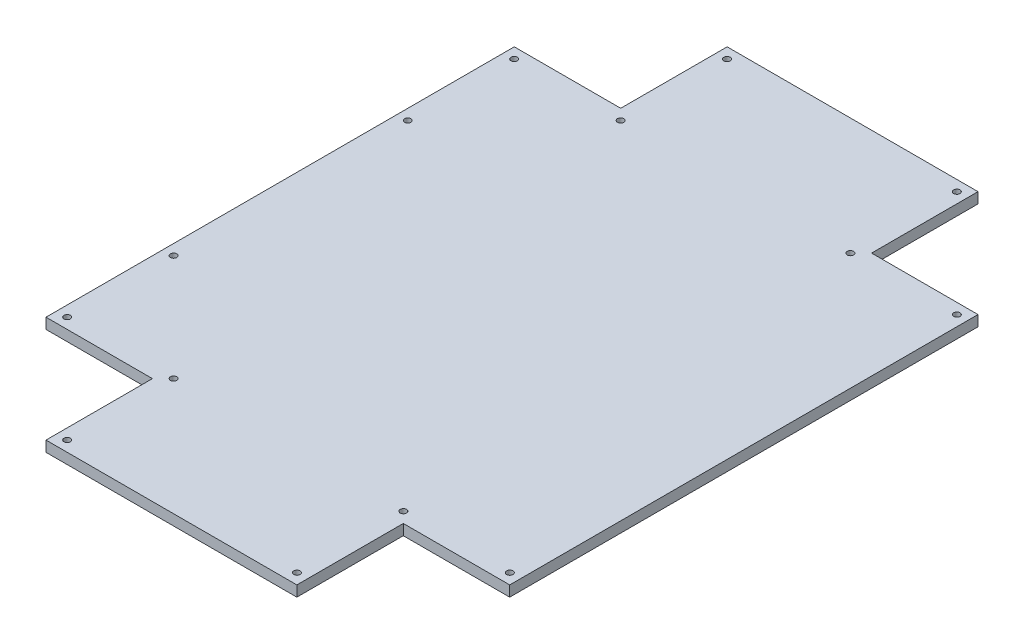
ISO-10303-21;
HEADER;
FILE_DESCRIPTION(('STEP AP214'),'2;1');
FILE_NAME('part.step','',(''),(''),'','','');
FILE_SCHEMA(('AUTOMOTIVE_DESIGN { 1 0 10303 214 1 1 1 1 }'));
ENDSEC;
DATA;
#1=APPLICATION_CONTEXT('core data for automotive mechanical design processes');
#2=APPLICATION_PROTOCOL_DEFINITION('international standard','automotive_design',2000,#1);
#3=PRODUCT_CONTEXT('',#1,'mechanical');
#4=PRODUCT('Part','Part','',(#3));
#5=PRODUCT_RELATED_PRODUCT_CATEGORY('part','',(#4));
#6=PRODUCT_DEFINITION_FORMATION('','',#4);
#7=PRODUCT_DEFINITION_CONTEXT('part definition',#1,'design');
#8=PRODUCT_DEFINITION('design','',#6,#7);
#9=PRODUCT_DEFINITION_SHAPE('','',#8);
#10=(LENGTH_UNIT() NAMED_UNIT(*) SI_UNIT(.MILLI.,.METRE.));
#11=(NAMED_UNIT(*) PLANE_ANGLE_UNIT() SI_UNIT($,.RADIAN.));
#12=(NAMED_UNIT(*) SI_UNIT($,.STERADIAN.) SOLID_ANGLE_UNIT());
#13=UNCERTAINTY_MEASURE_WITH_UNIT(LENGTH_MEASURE(1.E-05),#10,'distance_accuracy_value','');
#14=(GEOMETRIC_REPRESENTATION_CONTEXT(3) GLOBAL_UNCERTAINTY_ASSIGNED_CONTEXT((#13)) GLOBAL_UNIT_ASSIGNED_CONTEXT((#10,
#11,#12)) REPRESENTATION_CONTEXT('',''));
#15=CARTESIAN_POINT('',(0.,0.,0.));
#16=DIRECTION('',(0.,0.,1.));
#17=DIRECTION('',(1.,0.,0.));
#18=AXIS2_PLACEMENT_3D('',#15,#16,#17);
#19=CARTESIAN_POINT('',(0.,5.,0.));
#20=DIRECTION('',(0.,1.,0.));
#21=DIRECTION('',(0.,0.,1.));
#22=AXIS2_PLACEMENT_3D('',#19,#20,#21);
#23=PLANE('',#22);
#24=CARTESIAN_POINT('',(53.9763023364413,5.,-105.));
#25=DIRECTION('',(0.,1.,0.));
#26=DIRECTION('',(0.,0.,1.));
#27=AXIS2_PLACEMENT_3D('',#24,#25,#26);
#28=CIRCLE('',#27,1.5);
#29=CARTESIAN_POINT('',(53.9763023364413,5.,-103.5));
#30=VERTEX_POINT('',#29);
#31=EDGE_CURVE('E530',#30,#30,#28,.T.);
#32=ORIENTED_EDGE('',*,*,#31,.F.);
#33=EDGE_LOOP('',(#32));
#34=FACE_BOUND('',#33,.T.);
#35=CARTESIAN_POINT('',(103.976302336441,5.,105.));
#36=DIRECTION('',(0.,1.,0.));
#37=DIRECTION('',(0.,0.,-1.));
#38=AXIS2_PLACEMENT_3D('',#35,#36,#37);
#39=CIRCLE('',#38,1.50000000000011);
#40=CARTESIAN_POINT('',(103.976302336441,5.,103.5));
#41=VERTEX_POINT('',#40);
#42=EDGE_CURVE('E542',#41,#41,#39,.T.);
#43=ORIENTED_EDGE('',*,*,#42,.F.);
#44=EDGE_LOOP('',(#43));
#45=FACE_BOUND('',#44,.T.);
#46=CARTESIAN_POINT('',(53.9763023364413,5.,155.));
#47=DIRECTION('',(0.,1.,0.));
#48=DIRECTION('',(0.,0.,-1.));
#49=AXIS2_PLACEMENT_3D('',#46,#47,#48);
#50=CIRCLE('',#49,1.5);
#51=CARTESIAN_POINT('',(53.9763023364413,5.,153.5));
#52=VERTEX_POINT('',#51);
#53=EDGE_CURVE('E554',#52,#52,#50,.T.);
#54=ORIENTED_EDGE('',*,*,#53,.F.);
#55=EDGE_LOOP('',(#54));
#56=FACE_BOUND('',#55,.T.);
#57=CARTESIAN_POINT('',(-103.976302336441,5.,-105.));
#58=DIRECTION('',(0.,1.,0.));
#59=DIRECTION('',(0.,0.,-1.));
#60=AXIS2_PLACEMENT_3D('',#57,#58,#59);
#61=CIRCLE('',#60,1.5);
#62=CARTESIAN_POINT('',(-103.976302336441,5.,-106.5));
#63=VERTEX_POINT('',#62);
#64=EDGE_CURVE('E566',#63,#63,#61,.T.);
#65=ORIENTED_EDGE('',*,*,#64,.F.);
#66=EDGE_LOOP('',(#65));
#67=FACE_BOUND('',#66,.T.);
#68=CARTESIAN_POINT('',(-53.9763023364413,5.,155.));
#69=DIRECTION('',(0.,1.,0.));
#70=DIRECTION('',(0.,0.,1.));
#71=AXIS2_PLACEMENT_3D('',#68,#69,#70);
#72=CIRCLE('',#71,1.5);
#73=CARTESIAN_POINT('',(-53.9763023364413,5.,156.5));
#74=VERTEX_POINT('',#73);
#75=EDGE_CURVE('E578',#74,#74,#72,.T.);
#76=ORIENTED_EDGE('',*,*,#75,.F.);
#77=EDGE_LOOP('',(#76));
#78=FACE_BOUND('',#77,.T.);
#79=CARTESIAN_POINT('',(-103.976302336441,5.,55.));
#80=DIRECTION('',(0.,1.,0.));
#81=DIRECTION('',(0.,0.,1.));
#82=AXIS2_PLACEMENT_3D('',#79,#80,#81);
#83=CIRCLE('',#82,1.5);
#84=CARTESIAN_POINT('',(-103.976302336441,5.,56.4999999999999));
#85=VERTEX_POINT('',#84);
#86=EDGE_CURVE('E590',#85,#85,#83,.T.);
#87=ORIENTED_EDGE('',*,*,#86,.F.);
#88=EDGE_LOOP('',(#87));
#89=FACE_BOUND('',#88,.T.);
#90=CARTESIAN_POINT('',(-103.976302336441,5.,105.));
#91=DIRECTION('',(0.,1.,0.));
#92=DIRECTION('',(0.,0.,1.));
#93=AXIS2_PLACEMENT_3D('',#90,#91,#92);
#94=CIRCLE('',#93,1.5);
#95=CARTESIAN_POINT('',(-103.976302336441,5.,106.5));
#96=VERTEX_POINT('',#95);
#97=EDGE_CURVE('E156',#96,#96,#94,.T.);
#98=ORIENTED_EDGE('',*,*,#97,.F.);
#99=EDGE_LOOP('',(#98));
#100=FACE_BOUND('',#99,.T.);
#101=DIRECTION('',(0.,0.,1.));
#102=VECTOR('',#101,1.);
#103=CARTESIAN_POINT('',(-108.927554828653,5.,0.));
#104=LINE('',#103,#102);
#105=CARTESIAN_POINT('',(-108.927554828653,5.,-110.));
#106=VERTEX_POINT('',#105);
#107=CARTESIAN_POINT('',(-108.927554828653,5.,110.));
#108=VERTEX_POINT('',#107);
#109=EDGE_CURVE('E104',#106,#108,#104,.T.);
#110=ORIENTED_EDGE('',*,*,#109,.T.);
#111=DIRECTION('',(1.,0.,0.));
#112=VECTOR('',#111,1.);
#113=CARTESIAN_POINT('',(-58.9275548286528,5.,110.));
#114=LINE('',#113,#112);
#115=CARTESIAN_POINT('',(-58.9275548286528,5.,110.));
#116=VERTEX_POINT('',#115);
#117=EDGE_CURVE('E245',#108,#116,#114,.T.);
#118=ORIENTED_EDGE('',*,*,#117,.T.);
#119=DIRECTION('',(0.,0.,1.));
#120=VECTOR('',#119,1.);
#121=CARTESIAN_POINT('',(-58.9275548286528,5.,110.));
#122=LINE('',#121,#120);
#123=CARTESIAN_POINT('',(-58.9275548286528,5.,160.));
#124=VERTEX_POINT('',#123);
#125=EDGE_CURVE('E204',#116,#124,#122,.T.);
#126=ORIENTED_EDGE('',*,*,#125,.T.);
#127=DIRECTION('',(1.,0.,0.));
#128=VECTOR('',#127,1.);
#129=CARTESIAN_POINT('',(-58.9275548286528,5.,160.));
#130=LINE('',#129,#128);
#131=CARTESIAN_POINT('',(58.9275548286527,5.,160.));
#132=VERTEX_POINT('',#131);
#133=EDGE_CURVE('E223',#124,#132,#130,.T.);
#134=ORIENTED_EDGE('',*,*,#133,.T.);
#135=DIRECTION('',(0.,0.,-1.));
#136=VECTOR('',#135,1.);
#137=CARTESIAN_POINT('',(58.9275548286527,5.,160.));
#138=LINE('',#137,#136);
#139=CARTESIAN_POINT('',(58.9275548286528,5.,110.));
#140=VERTEX_POINT('',#139);
#141=EDGE_CURVE('E220',#132,#140,#138,.T.);
#142=ORIENTED_EDGE('',*,*,#141,.T.);
#143=DIRECTION('',(1.,0.,0.));
#144=VECTOR('',#143,1.);
#145=CARTESIAN_POINT('',(108.927554828653,5.,110.));
#146=LINE('',#145,#144);
#147=CARTESIAN_POINT('',(108.927554828653,5.,110.));
#148=VERTEX_POINT('',#147);
#149=EDGE_CURVE('E222',#140,#148,#146,.T.);
#150=ORIENTED_EDGE('',*,*,#149,.T.);
#151=DIRECTION('',(0.,0.,-1.));
#152=VECTOR('',#151,1.);
#153=CARTESIAN_POINT('',(108.927554828653,5.,110.));
#154=LINE('',#153,#152);
#155=CARTESIAN_POINT('',(108.927554828653,5.,-110.));
#156=VERTEX_POINT('',#155);
#157=EDGE_CURVE('E225',#148,#156,#154,.T.);
#158=ORIENTED_EDGE('',*,*,#157,.T.);
#159=DIRECTION('',(-1.,0.,0.));
#160=VECTOR('',#159,1.);
#161=CARTESIAN_POINT('',(108.927554828653,5.,-110.));
#162=LINE('',#161,#160);
#163=CARTESIAN_POINT('',(58.9275548286528,5.,-110.));
#164=VERTEX_POINT('',#163);
#165=EDGE_CURVE('E231',#156,#164,#162,.T.);
#166=ORIENTED_EDGE('',*,*,#165,.T.);
#167=DIRECTION('',(0.,0.,-1.));
#168=VECTOR('',#167,1.);
#169=CARTESIAN_POINT('',(58.9275548286527,5.,-160.));
#170=LINE('',#169,#168);
#171=CARTESIAN_POINT('',(58.9275548286527,5.,-160.));
#172=VERTEX_POINT('',#171);
#173=EDGE_CURVE('E136',#164,#172,#170,.T.);
#174=ORIENTED_EDGE('',*,*,#173,.T.);
#175=DIRECTION('',(-1.,0.,0.));
#176=VECTOR('',#175,1.);
#177=CARTESIAN_POINT('',(-58.9275548286528,5.,-160.));
#178=LINE('',#177,#176);
#179=CARTESIAN_POINT('',(-58.9275548286528,5.,-160.));
#180=VERTEX_POINT('',#179);
#181=EDGE_CURVE('E130',#172,#180,#178,.T.);
#182=ORIENTED_EDGE('',*,*,#181,.T.);
#183=DIRECTION('',(0.,0.,1.));
#184=VECTOR('',#183,1.);
#185=CARTESIAN_POINT('',(-58.9275548286528,5.,-110.));
#186=LINE('',#185,#184);
#187=CARTESIAN_POINT('',(-58.9275548286528,5.,-110.));
#188=VERTEX_POINT('',#187);
#189=EDGE_CURVE('E134',#180,#188,#186,.T.);
#190=ORIENTED_EDGE('',*,*,#189,.T.);
#191=DIRECTION('',(-1.,0.,0.));
#192=VECTOR('',#191,1.);
#193=CARTESIAN_POINT('',(-58.9275548286528,5.,-110.));
#194=LINE('',#193,#192);
#195=EDGE_CURVE('E50',#188,#106,#194,.T.);
#196=ORIENTED_EDGE('',*,*,#195,.T.);
#197=EDGE_LOOP('',(#110,#118,#126,#134,#142,#150,#158,#166,#174,#182,#190,#196));
#198=FACE_BOUND('',#197,.T.);
#199=CARTESIAN_POINT('',(-53.9763023364413,5.,-155.));
#200=DIRECTION('',(0.,1.,0.));
#201=DIRECTION('',(0.,0.,-1.));
#202=AXIS2_PLACEMENT_3D('',#199,#200,#201);
#203=CIRCLE('',#202,1.5);
#204=CARTESIAN_POINT('',(-53.9763023364413,5.,-156.5));
#205=VERTEX_POINT('',#204);
#206=EDGE_CURVE('E596',#205,#205,#203,.T.);
#207=ORIENTED_EDGE('',*,*,#206,.F.);
#208=EDGE_LOOP('',(#207));
#209=FACE_BOUND('',#208,.T.);
#210=CARTESIAN_POINT('',(-53.9763023364413,5.,105.));
#211=DIRECTION('',(0.,1.,0.));
#212=DIRECTION('',(0.,0.,1.));
#213=AXIS2_PLACEMENT_3D('',#210,#211,#212);
#214=CIRCLE('',#213,1.5);
#215=CARTESIAN_POINT('',(-53.9763023364413,5.,106.5));
#216=VERTEX_POINT('',#215);
#217=EDGE_CURVE('E584',#216,#216,#214,.T.);
#218=ORIENTED_EDGE('',*,*,#217,.F.);
#219=EDGE_LOOP('',(#218));
#220=FACE_BOUND('',#219,.T.);
#221=CARTESIAN_POINT('',(-53.9763023364413,5.,-105.));
#222=DIRECTION('',(0.,1.,0.));
#223=DIRECTION('',(0.,0.,-1.));
#224=AXIS2_PLACEMENT_3D('',#221,#222,#223);
#225=CIRCLE('',#224,1.5);
#226=CARTESIAN_POINT('',(-53.9763023364413,5.,-106.5));
#227=VERTEX_POINT('',#226);
#228=EDGE_CURVE('E572',#227,#227,#225,.T.);
#229=ORIENTED_EDGE('',*,*,#228,.F.);
#230=EDGE_LOOP('',(#229));
#231=FACE_BOUND('',#230,.T.);
#232=CARTESIAN_POINT('',(-103.976302336441,5.,-55.));
#233=DIRECTION('',(0.,1.,0.));
#234=DIRECTION('',(0.,0.,-1.));
#235=AXIS2_PLACEMENT_3D('',#232,#233,#234);
#236=CIRCLE('',#235,1.5);
#237=CARTESIAN_POINT('',(-103.976302336441,5.,-56.5));
#238=VERTEX_POINT('',#237);
#239=EDGE_CURVE('E560',#238,#238,#236,.T.);
#240=ORIENTED_EDGE('',*,*,#239,.F.);
#241=EDGE_LOOP('',(#240));
#242=FACE_BOUND('',#241,.T.);
#243=CARTESIAN_POINT('',(53.9763023364413,5.,105.));
#244=DIRECTION('',(0.,1.,0.));
#245=DIRECTION('',(0.,0.,-1.));
#246=AXIS2_PLACEMENT_3D('',#243,#244,#245);
#247=CIRCLE('',#246,1.5);
#248=CARTESIAN_POINT('',(53.9763023364413,5.,103.5));
#249=VERTEX_POINT('',#248);
#250=EDGE_CURVE('E548',#249,#249,#247,.T.);
#251=ORIENTED_EDGE('',*,*,#250,.F.);
#252=EDGE_LOOP('',(#251));
#253=FACE_BOUND('',#252,.T.);
#254=CARTESIAN_POINT('',(103.976302336441,5.,-105.));
#255=DIRECTION('',(0.,1.,0.));
#256=DIRECTION('',(0.,0.,1.));
#257=AXIS2_PLACEMENT_3D('',#254,#255,#256);
#258=CIRCLE('',#257,1.5);
#259=CARTESIAN_POINT('',(103.976302336441,5.,-103.5));
#260=VERTEX_POINT('',#259);
#261=EDGE_CURVE('E536',#260,#260,#258,.T.);
#262=ORIENTED_EDGE('',*,*,#261,.F.);
#263=EDGE_LOOP('',(#262));
#264=FACE_BOUND('',#263,.T.);
#265=CARTESIAN_POINT('',(53.9763023364413,5.,-155.));
#266=DIRECTION('',(0.,1.,0.));
#267=DIRECTION('',(0.,0.,1.));
#268=AXIS2_PLACEMENT_3D('',#265,#266,#267);
#269=CIRCLE('',#268,1.5);
#270=CARTESIAN_POINT('',(53.9763023364413,5.,-153.5));
#271=VERTEX_POINT('',#270);
#272=EDGE_CURVE('E521',#271,#271,#269,.T.);
#273=ORIENTED_EDGE('',*,*,#272,.F.);
#274=EDGE_LOOP('',(#273));
#275=FACE_BOUND('',#274,.T.);
#276=ADVANCED_FACE('F33',(#34,#45,#56,#67,#78,#89,#100,#198,#209,#220,#231,#242,#253,#264,#275),
#23,.T.);
#277=CARTESIAN_POINT('',(0.,0.,0.));
#278=DIRECTION('',(0.,1.,0.));
#279=DIRECTION('',(0.,0.,1.));
#280=AXIS2_PLACEMENT_3D('',#277,#278,#279);
#281=PLANE('',#280);
#282=DIRECTION('',(0.,0.,1.));
#283=VECTOR('',#282,1.);
#284=CARTESIAN_POINT('',(-108.927554828653,0.,110.));
#285=LINE('',#284,#283);
#286=CARTESIAN_POINT('',(-108.927554828653,0.,-110.));
#287=VERTEX_POINT('',#286);
#288=CARTESIAN_POINT('',(-108.927554828653,0.,110.));
#289=VERTEX_POINT('',#288);
#290=EDGE_CURVE('E98',#287,#289,#285,.T.);
#291=ORIENTED_EDGE('',*,*,#290,.F.);
#292=DIRECTION('',(-1.,0.,0.));
#293=VECTOR('',#292,1.);
#294=CARTESIAN_POINT('',(-58.9275548286528,0.,-110.));
#295=LINE('',#294,#293);
#296=CARTESIAN_POINT('',(-58.9275548286528,0.,-110.));
#297=VERTEX_POINT('',#296);
#298=EDGE_CURVE('E174',#297,#287,#295,.T.);
#299=ORIENTED_EDGE('',*,*,#298,.F.);
#300=DIRECTION('',(0.,0.,1.));
#301=VECTOR('',#300,1.);
#302=CARTESIAN_POINT('',(-58.9275548286528,0.,-110.));
#303=LINE('',#302,#301);
#304=CARTESIAN_POINT('',(-58.9275548286528,0.,-160.));
#305=VERTEX_POINT('',#304);
#306=EDGE_CURVE('E91',#305,#297,#303,.T.);
#307=ORIENTED_EDGE('',*,*,#306,.F.);
#308=DIRECTION('',(-1.,0.,0.));
#309=VECTOR('',#308,1.);
#310=CARTESIAN_POINT('',(-58.9275548286528,0.,-160.));
#311=LINE('',#310,#309);
#312=CARTESIAN_POINT('',(58.9275548286527,0.,-160.));
#313=VERTEX_POINT('',#312);
#314=EDGE_CURVE('E144',#313,#305,#311,.T.);
#315=ORIENTED_EDGE('',*,*,#314,.F.);
#316=DIRECTION('',(0.,0.,-1.));
#317=VECTOR('',#316,1.);
#318=CARTESIAN_POINT('',(58.9275548286527,0.,-160.));
#319=LINE('',#318,#317);
#320=CARTESIAN_POINT('',(58.9275548286528,0.,-110.));
#321=VERTEX_POINT('',#320);
#322=EDGE_CURVE('E170',#321,#313,#319,.T.);
#323=ORIENTED_EDGE('',*,*,#322,.F.);
#324=DIRECTION('',(-1.,0.,0.));
#325=VECTOR('',#324,1.);
#326=CARTESIAN_POINT('',(108.927554828653,0.,-110.));
#327=LINE('',#326,#325);
#328=CARTESIAN_POINT('',(108.927554828653,0.,-110.));
#329=VERTEX_POINT('',#328);
#330=EDGE_CURVE('E168',#329,#321,#327,.T.);
#331=ORIENTED_EDGE('',*,*,#330,.F.);
#332=DIRECTION('',(0.,0.,-1.));
#333=VECTOR('',#332,1.);
#334=CARTESIAN_POINT('',(108.927554828653,0.,110.));
#335=LINE('',#334,#333);
#336=CARTESIAN_POINT('',(108.927554828653,0.,110.));
#337=VERTEX_POINT('',#336);
#338=EDGE_CURVE('E166',#337,#329,#335,.T.);
#339=ORIENTED_EDGE('',*,*,#338,.F.);
#340=DIRECTION('',(1.,0.,0.));
#341=VECTOR('',#340,1.);
#342=CARTESIAN_POINT('',(108.927554828653,0.,110.));
#343=LINE('',#342,#341);
#344=CARTESIAN_POINT('',(58.9275548286528,0.,110.));
#345=VERTEX_POINT('',#344);
#346=EDGE_CURVE('E164',#345,#337,#343,.T.);
#347=ORIENTED_EDGE('',*,*,#346,.F.);
#348=DIRECTION('',(0.,0.,-1.));
#349=VECTOR('',#348,1.);
#350=CARTESIAN_POINT('',(58.9275548286527,0.,160.));
#351=LINE('',#350,#349);
#352=CARTESIAN_POINT('',(58.9275548286527,0.,160.));
#353=VERTEX_POINT('',#352);
#354=EDGE_CURVE('E162',#353,#345,#351,.T.);
#355=ORIENTED_EDGE('',*,*,#354,.F.);
#356=DIRECTION('',(1.,0.,0.));
#357=VECTOR('',#356,1.);
#358=CARTESIAN_POINT('',(-58.9275548286528,0.,160.));
#359=LINE('',#358,#357);
#360=CARTESIAN_POINT('',(-58.9275548286528,0.,160.));
#361=VERTEX_POINT('',#360);
#362=EDGE_CURVE('E160',#361,#353,#359,.T.);
#363=ORIENTED_EDGE('',*,*,#362,.F.);
#364=DIRECTION('',(0.,0.,1.));
#365=VECTOR('',#364,1.);
#366=CARTESIAN_POINT('',(-58.9275548286528,0.,110.));
#367=LINE('',#366,#365);
#368=CARTESIAN_POINT('',(-58.9275548286528,0.,110.));
#369=VERTEX_POINT('',#368);
#370=EDGE_CURVE('E158',#369,#361,#367,.T.);
#371=ORIENTED_EDGE('',*,*,#370,.F.);
#372=DIRECTION('',(1.,0.,0.));
#373=VECTOR('',#372,1.);
#374=CARTESIAN_POINT('',(-58.9275548286528,0.,110.));
#375=LINE('',#374,#373);
#376=EDGE_CURVE('E155',#289,#369,#375,.T.);
#377=ORIENTED_EDGE('',*,*,#376,.F.);
#378=EDGE_LOOP('',(#291,#299,#307,#315,#323,#331,#339,#347,#355,#363,#371,#377));
#379=FACE_BOUND('',#378,.T.);
#380=CARTESIAN_POINT('',(-103.976302336441,0.,105.));
#381=DIRECTION('',(0.,1.,0.));
#382=DIRECTION('',(0.,0.,1.));
#383=AXIS2_PLACEMENT_3D('',#380,#381,#382);
#384=CIRCLE('',#383,1.5);
#385=CARTESIAN_POINT('',(-103.976302336441,0.,106.5));
#386=VERTEX_POINT('',#385);
#387=EDGE_CURVE('E249',#386,#386,#384,.T.);
#388=ORIENTED_EDGE('',*,*,#387,.T.);
#389=EDGE_LOOP('',(#388));
#390=FACE_BOUND('',#389,.T.);
#391=CARTESIAN_POINT('',(-53.9763023364413,0.,-155.));
#392=DIRECTION('',(0.,1.,0.));
#393=DIRECTION('',(0.,0.,-1.));
#394=AXIS2_PLACEMENT_3D('',#391,#392,#393);
#395=CIRCLE('',#394,1.5);
#396=CARTESIAN_POINT('',(-53.9763023364413,0.,-156.5));
#397=VERTEX_POINT('',#396);
#398=EDGE_CURVE('E593',#397,#397,#395,.T.);
#399=ORIENTED_EDGE('',*,*,#398,.T.);
#400=EDGE_LOOP('',(#399));
#401=FACE_BOUND('',#400,.T.);
#402=CARTESIAN_POINT('',(-103.976302336441,0.,55.));
#403=DIRECTION('',(0.,1.,0.));
#404=DIRECTION('',(0.,0.,1.));
#405=AXIS2_PLACEMENT_3D('',#402,#403,#404);
#406=CIRCLE('',#405,1.5);
#407=CARTESIAN_POINT('',(-103.976302336441,0.,56.4999999999999));
#408=VERTEX_POINT('',#407);
#409=EDGE_CURVE('E587',#408,#408,#406,.T.);
#410=ORIENTED_EDGE('',*,*,#409,.T.);
#411=EDGE_LOOP('',(#410));
#412=FACE_BOUND('',#411,.T.);
#413=CARTESIAN_POINT('',(-53.9763023364413,0.,105.));
#414=DIRECTION('',(0.,1.,0.));
#415=DIRECTION('',(0.,0.,1.));
#416=AXIS2_PLACEMENT_3D('',#413,#414,#415);
#417=CIRCLE('',#416,1.5);
#418=CARTESIAN_POINT('',(-53.9763023364413,0.,106.5));
#419=VERTEX_POINT('',#418);
#420=EDGE_CURVE('E581',#419,#419,#417,.T.);
#421=ORIENTED_EDGE('',*,*,#420,.T.);
#422=EDGE_LOOP('',(#421));
#423=FACE_BOUND('',#422,.T.);
#424=CARTESIAN_POINT('',(-53.9763023364413,0.,155.));
#425=DIRECTION('',(0.,1.,0.));
#426=DIRECTION('',(0.,0.,1.));
#427=AXIS2_PLACEMENT_3D('',#424,#425,#426);
#428=CIRCLE('',#427,1.5);
#429=CARTESIAN_POINT('',(-53.9763023364413,0.,156.5));
#430=VERTEX_POINT('',#429);
#431=EDGE_CURVE('E575',#430,#430,#428,.T.);
#432=ORIENTED_EDGE('',*,*,#431,.T.);
#433=EDGE_LOOP('',(#432));
#434=FACE_BOUND('',#433,.T.);
#435=CARTESIAN_POINT('',(-53.9763023364413,0.,-105.));
#436=DIRECTION('',(0.,1.,0.));
#437=DIRECTION('',(0.,0.,-1.));
#438=AXIS2_PLACEMENT_3D('',#435,#436,#437);
#439=CIRCLE('',#438,1.5);
#440=CARTESIAN_POINT('',(-53.9763023364413,0.,-106.5));
#441=VERTEX_POINT('',#440);
#442=EDGE_CURVE('E569',#441,#441,#439,.T.);
#443=ORIENTED_EDGE('',*,*,#442,.T.);
#444=EDGE_LOOP('',(#443));
#445=FACE_BOUND('',#444,.T.);
#446=CARTESIAN_POINT('',(-103.976302336441,0.,-105.));
#447=DIRECTION('',(0.,1.,0.));
#448=DIRECTION('',(0.,0.,-1.));
#449=AXIS2_PLACEMENT_3D('',#446,#447,#448);
#450=CIRCLE('',#449,1.5);
#451=CARTESIAN_POINT('',(-103.976302336441,0.,-106.5));
#452=VERTEX_POINT('',#451);
#453=EDGE_CURVE('E563',#452,#452,#450,.T.);
#454=ORIENTED_EDGE('',*,*,#453,.T.);
#455=EDGE_LOOP('',(#454));
#456=FACE_BOUND('',#455,.T.);
#457=CARTESIAN_POINT('',(-103.976302336441,0.,-55.));
#458=DIRECTION('',(0.,1.,0.));
#459=DIRECTION('',(0.,0.,-1.));
#460=AXIS2_PLACEMENT_3D('',#457,#458,#459);
#461=CIRCLE('',#460,1.5);
#462=CARTESIAN_POINT('',(-103.976302336441,0.,-56.5));
#463=VERTEX_POINT('',#462);
#464=EDGE_CURVE('E557',#463,#463,#461,.T.);
#465=ORIENTED_EDGE('',*,*,#464,.T.);
#466=EDGE_LOOP('',(#465));
#467=FACE_BOUND('',#466,.T.);
#468=CARTESIAN_POINT('',(53.9763023364413,0.,155.));
#469=DIRECTION('',(0.,1.,0.));
#470=DIRECTION('',(0.,0.,-1.));
#471=AXIS2_PLACEMENT_3D('',#468,#469,#470);
#472=CIRCLE('',#471,1.5);
#473=CARTESIAN_POINT('',(53.9763023364413,0.,153.5));
#474=VERTEX_POINT('',#473);
#475=EDGE_CURVE('E551',#474,#474,#472,.T.);
#476=ORIENTED_EDGE('',*,*,#475,.T.);
#477=EDGE_LOOP('',(#476));
#478=FACE_BOUND('',#477,.T.);
#479=CARTESIAN_POINT('',(53.9763023364413,0.,105.));
#480=DIRECTION('',(0.,1.,0.));
#481=DIRECTION('',(0.,0.,-1.));
#482=AXIS2_PLACEMENT_3D('',#479,#480,#481);
#483=CIRCLE('',#482,1.5);
#484=CARTESIAN_POINT('',(53.9763023364413,0.,103.5));
#485=VERTEX_POINT('',#484);
#486=EDGE_CURVE('E545',#485,#485,#483,.T.);
#487=ORIENTED_EDGE('',*,*,#486,.T.);
#488=EDGE_LOOP('',(#487));
#489=FACE_BOUND('',#488,.T.);
#490=CARTESIAN_POINT('',(103.976302336441,0.,105.));
#491=DIRECTION('',(0.,1.,0.));
#492=DIRECTION('',(0.,0.,-1.));
#493=AXIS2_PLACEMENT_3D('',#490,#491,#492);
#494=CIRCLE('',#493,1.50000000000011);
#495=CARTESIAN_POINT('',(103.976302336441,0.,103.5));
#496=VERTEX_POINT('',#495);
#497=EDGE_CURVE('E539',#496,#496,#494,.T.);
#498=ORIENTED_EDGE('',*,*,#497,.T.);
#499=EDGE_LOOP('',(#498));
#500=FACE_BOUND('',#499,.T.);
#501=CARTESIAN_POINT('',(103.976302336441,0.,-105.));
#502=DIRECTION('',(0.,1.,0.));
#503=DIRECTION('',(0.,0.,1.));
#504=AXIS2_PLACEMENT_3D('',#501,#502,#503);
#505=CIRCLE('',#504,1.5);
#506=CARTESIAN_POINT('',(103.976302336441,0.,-103.5));
#507=VERTEX_POINT('',#506);
#508=EDGE_CURVE('E533',#507,#507,#505,.T.);
#509=ORIENTED_EDGE('',*,*,#508,.T.);
#510=EDGE_LOOP('',(#509));
#511=FACE_BOUND('',#510,.T.);
#512=CARTESIAN_POINT('',(53.9763023364413,0.,-105.));
#513=DIRECTION('',(0.,1.,0.));
#514=DIRECTION('',(0.,0.,1.));
#515=AXIS2_PLACEMENT_3D('',#512,#513,#514);
#516=CIRCLE('',#515,1.5);
#517=CARTESIAN_POINT('',(53.9763023364413,0.,-103.5));
#518=VERTEX_POINT('',#517);
#519=EDGE_CURVE('E527',#518,#518,#516,.T.);
#520=ORIENTED_EDGE('',*,*,#519,.T.);
#521=EDGE_LOOP('',(#520));
#522=FACE_BOUND('',#521,.T.);
#523=CARTESIAN_POINT('',(53.9763023364413,0.,-155.));
#524=DIRECTION('',(0.,1.,0.));
#525=DIRECTION('',(0.,0.,1.));
#526=AXIS2_PLACEMENT_3D('',#523,#524,#525);
#527=CIRCLE('',#526,1.5);
#528=CARTESIAN_POINT('',(53.9763023364413,0.,-153.5));
#529=VERTEX_POINT('',#528);
#530=EDGE_CURVE('E524',#529,#529,#527,.T.);
#531=ORIENTED_EDGE('',*,*,#530,.T.);
#532=EDGE_LOOP('',(#531));
#533=FACE_BOUND('',#532,.T.);
#534=ADVANCED_FACE('F208',(#379,#390,#401,#412,#423,#434,#445,#456,#467,#478,#489,#500,#511,
#522,#533),#281,.F.);
#535=CARTESIAN_POINT('',(-108.927554828653,5.,110.));
#536=DIRECTION('',(1.,0.,0.));
#537=DIRECTION('',(0.,0.,-1.));
#538=AXIS2_PLACEMENT_3D('',#535,#536,#537);
#539=PLANE('',#538);
#540=ORIENTED_EDGE('',*,*,#290,.T.);
#541=DIRECTION('',(0.,-1.,0.));
#542=VECTOR('',#541,1.);
#543=CARTESIAN_POINT('',(-108.927554828653,5.,110.));
#544=LINE('',#543,#542);
#545=EDGE_CURVE('E11',#108,#289,#544,.T.);
#546=ORIENTED_EDGE('',*,*,#545,.F.);
#547=ORIENTED_EDGE('',*,*,#109,.F.);
#548=DIRECTION('',(0.,-1.,0.));
#549=VECTOR('',#548,1.);
#550=CARTESIAN_POINT('',(-108.927554828653,5.,-110.));
#551=LINE('',#550,#549);
#552=EDGE_CURVE('E150',#106,#287,#551,.T.);
#553=ORIENTED_EDGE('',*,*,#552,.T.);
#554=EDGE_LOOP('',(#540,#546,#547,#553));
#555=FACE_BOUND('',#554,.T.);
#556=ADVANCED_FACE('F35',(#555),#539,.F.);
#557=CARTESIAN_POINT('',(-58.9275548286528,5.,110.));
#558=DIRECTION('',(0.,0.,-1.));
#559=DIRECTION('',(-1.,0.,0.));
#560=AXIS2_PLACEMENT_3D('',#557,#558,#559);
#561=PLANE('',#560);
#562=ORIENTED_EDGE('',*,*,#376,.T.);
#563=DIRECTION('',(0.,-1.,0.));
#564=VECTOR('',#563,1.);
#565=CARTESIAN_POINT('',(-58.9275548286528,5.,110.));
#566=LINE('',#565,#564);
#567=EDGE_CURVE('E42',#116,#369,#566,.T.);
#568=ORIENTED_EDGE('',*,*,#567,.F.);
#569=ORIENTED_EDGE('',*,*,#117,.F.);
#570=ORIENTED_EDGE('',*,*,#545,.T.);
#571=EDGE_LOOP('',(#562,#568,#569,#570));
#572=FACE_BOUND('',#571,.T.);
#573=ADVANCED_FACE('F251',(#572),#561,.F.);
#574=CARTESIAN_POINT('',(-58.9275548286528,5.,110.));
#575=DIRECTION('',(1.,0.,0.));
#576=DIRECTION('',(0.,0.,-1.));
#577=AXIS2_PLACEMENT_3D('',#574,#575,#576);
#578=PLANE('',#577);
#579=ORIENTED_EDGE('',*,*,#370,.T.);
#580=DIRECTION('',(0.,-1.,0.));
#581=VECTOR('',#580,1.);
#582=CARTESIAN_POINT('',(-58.9275548286528,5.,160.));
#583=LINE('',#582,#581);
#584=EDGE_CURVE('E195',#124,#361,#583,.T.);
#585=ORIENTED_EDGE('',*,*,#584,.F.);
#586=ORIENTED_EDGE('',*,*,#125,.F.);
#587=ORIENTED_EDGE('',*,*,#567,.T.);
#588=EDGE_LOOP('',(#579,#585,#586,#587));
#589=FACE_BOUND('',#588,.T.);
#590=ADVANCED_FACE('F202',(#589),#578,.F.);
#591=CARTESIAN_POINT('',(-58.9275548286528,5.,160.));
#592=DIRECTION('',(0.,0.,-1.));
#593=DIRECTION('',(-1.,0.,0.));
#594=AXIS2_PLACEMENT_3D('',#591,#592,#593);
#595=PLANE('',#594);
#596=ORIENTED_EDGE('',*,*,#362,.T.);
#597=DIRECTION('',(0.,-1.,0.));
#598=VECTOR('',#597,1.);
#599=CARTESIAN_POINT('',(58.9275548286527,5.,160.));
#600=LINE('',#599,#598);
#601=EDGE_CURVE('E192',#132,#353,#600,.T.);
#602=ORIENTED_EDGE('',*,*,#601,.F.);
#603=ORIENTED_EDGE('',*,*,#133,.F.);
#604=ORIENTED_EDGE('',*,*,#584,.T.);
#605=EDGE_LOOP('',(#596,#602,#603,#604));
#606=FACE_BOUND('',#605,.T.);
#607=ADVANCED_FACE('F214',(#606),#595,.F.);
#608=CARTESIAN_POINT('',(58.9275548286527,5.,160.));
#609=DIRECTION('',(-1.,0.,0.));
#610=DIRECTION('',(0.,0.,1.));
#611=AXIS2_PLACEMENT_3D('',#608,#609,#610);
#612=PLANE('',#611);
#613=ORIENTED_EDGE('',*,*,#354,.T.);
#614=DIRECTION('',(0.,-1.,0.));
#615=VECTOR('',#614,1.);
#616=CARTESIAN_POINT('',(58.9275548286528,5.,110.));
#617=LINE('',#616,#615);
#618=EDGE_CURVE('E189',#140,#345,#617,.T.);
#619=ORIENTED_EDGE('',*,*,#618,.F.);
#620=ORIENTED_EDGE('',*,*,#141,.F.);
#621=ORIENTED_EDGE('',*,*,#601,.T.);
#622=EDGE_LOOP('',(#613,#619,#620,#621));
#623=FACE_BOUND('',#622,.T.);
#624=ADVANCED_FACE('F218',(#623),#612,.F.);
#625=CARTESIAN_POINT('',(108.927554828653,5.,110.));
#626=DIRECTION('',(0.,0.,-1.));
#627=DIRECTION('',(-1.,0.,0.));
#628=AXIS2_PLACEMENT_3D('',#625,#626,#627);
#629=PLANE('',#628);
#630=ORIENTED_EDGE('',*,*,#346,.T.);
#631=DIRECTION('',(0.,-1.,0.));
#632=VECTOR('',#631,1.);
#633=CARTESIAN_POINT('',(108.927554828653,5.,110.));
#634=LINE('',#633,#632);
#635=EDGE_CURVE('E186',#148,#337,#634,.T.);
#636=ORIENTED_EDGE('',*,*,#635,.F.);
#637=ORIENTED_EDGE('',*,*,#149,.F.);
#638=ORIENTED_EDGE('',*,*,#618,.T.);
#639=EDGE_LOOP('',(#630,#636,#637,#638));
#640=FACE_BOUND('',#639,.T.);
#641=ADVANCED_FACE('F284',(#640),#629,.F.);
#642=CARTESIAN_POINT('',(108.927554828653,5.,110.));
#643=DIRECTION('',(-1.,0.,0.));
#644=DIRECTION('',(0.,0.,1.));
#645=AXIS2_PLACEMENT_3D('',#642,#643,#644);
#646=PLANE('',#645);
#647=ORIENTED_EDGE('',*,*,#338,.T.);
#648=DIRECTION('',(0.,-1.,0.));
#649=VECTOR('',#648,1.);
#650=CARTESIAN_POINT('',(108.927554828653,5.,-110.));
#651=LINE('',#650,#649);
#652=EDGE_CURVE('E183',#156,#329,#651,.T.);
#653=ORIENTED_EDGE('',*,*,#652,.F.);
#654=ORIENTED_EDGE('',*,*,#157,.F.);
#655=ORIENTED_EDGE('',*,*,#635,.T.);
#656=EDGE_LOOP('',(#647,#653,#654,#655));
#657=FACE_BOUND('',#656,.T.);
#658=ADVANCED_FACE('F281',(#657),#646,.F.);
#659=CARTESIAN_POINT('',(108.927554828653,5.,-110.));
#660=DIRECTION('',(0.,0.,1.));
#661=DIRECTION('',(1.,0.,0.));
#662=AXIS2_PLACEMENT_3D('',#659,#660,#661);
#663=PLANE('',#662);
#664=ORIENTED_EDGE('',*,*,#330,.T.);
#665=DIRECTION('',(0.,-1.,0.));
#666=VECTOR('',#665,1.);
#667=CARTESIAN_POINT('',(58.9275548286528,5.,-110.));
#668=LINE('',#667,#666);
#669=EDGE_CURVE('E180',#164,#321,#668,.T.);
#670=ORIENTED_EDGE('',*,*,#669,.F.);
#671=ORIENTED_EDGE('',*,*,#165,.F.);
#672=ORIENTED_EDGE('',*,*,#652,.T.);
#673=EDGE_LOOP('',(#664,#670,#671,#672));
#674=FACE_BOUND('',#673,.T.);
#675=ADVANCED_FACE('F237',(#674),#663,.F.);
#676=CARTESIAN_POINT('',(58.9275548286527,5.,-160.));
#677=DIRECTION('',(-1.,0.,0.));
#678=DIRECTION('',(0.,0.,1.));
#679=AXIS2_PLACEMENT_3D('',#676,#677,#678);
#680=PLANE('',#679);
#681=ORIENTED_EDGE('',*,*,#322,.T.);
#682=DIRECTION('',(0.,-1.,0.));
#683=VECTOR('',#682,1.);
#684=CARTESIAN_POINT('',(58.9275548286527,5.,-160.));
#685=LINE('',#684,#683);
#686=EDGE_CURVE('E145',#172,#313,#685,.T.);
#687=ORIENTED_EDGE('',*,*,#686,.F.);
#688=ORIENTED_EDGE('',*,*,#173,.F.);
#689=ORIENTED_EDGE('',*,*,#669,.T.);
#690=EDGE_LOOP('',(#681,#687,#688,#689));
#691=FACE_BOUND('',#690,.T.);
#692=ADVANCED_FACE('F241',(#691),#680,.F.);
#693=CARTESIAN_POINT('',(-58.9275548286528,5.,-160.));
#694=DIRECTION('',(0.,0.,1.));
#695=DIRECTION('',(1.,0.,0.));
#696=AXIS2_PLACEMENT_3D('',#693,#694,#695);
#697=PLANE('',#696);
#698=ORIENTED_EDGE('',*,*,#314,.T.);
#699=DIRECTION('',(0.,-1.,0.));
#700=VECTOR('',#699,1.);
#701=CARTESIAN_POINT('',(-58.9275548286528,5.,-160.));
#702=LINE('',#701,#700);
#703=EDGE_CURVE('E141',#180,#305,#702,.T.);
#704=ORIENTED_EDGE('',*,*,#703,.F.);
#705=ORIENTED_EDGE('',*,*,#181,.F.);
#706=ORIENTED_EDGE('',*,*,#686,.T.);
#707=EDGE_LOOP('',(#698,#704,#705,#706));
#708=FACE_BOUND('',#707,.T.);
#709=ADVANCED_FACE('F142',(#708),#697,.F.);
#710=CARTESIAN_POINT('',(-58.9275548286528,5.,-110.));
#711=DIRECTION('',(1.,0.,0.));
#712=DIRECTION('',(0.,0.,-1.));
#713=AXIS2_PLACEMENT_3D('',#710,#711,#712);
#714=PLANE('',#713);
#715=ORIENTED_EDGE('',*,*,#306,.T.);
#716=DIRECTION('',(0.,-1.,0.));
#717=VECTOR('',#716,1.);
#718=CARTESIAN_POINT('',(-58.9275548286528,5.,-110.));
#719=LINE('',#718,#717);
#720=EDGE_CURVE('E146',#188,#297,#719,.T.);
#721=ORIENTED_EDGE('',*,*,#720,.F.);
#722=ORIENTED_EDGE('',*,*,#189,.F.);
#723=ORIENTED_EDGE('',*,*,#703,.T.);
#724=EDGE_LOOP('',(#715,#721,#722,#723));
#725=FACE_BOUND('',#724,.T.);
#726=ADVANCED_FACE('F148',(#725),#714,.F.);
#727=CARTESIAN_POINT('',(-58.9275548286528,5.,-110.));
#728=DIRECTION('',(0.,0.,1.));
#729=DIRECTION('',(1.,0.,0.));
#730=AXIS2_PLACEMENT_3D('',#727,#728,#729);
#731=PLANE('',#730);
#732=ORIENTED_EDGE('',*,*,#298,.T.);
#733=ORIENTED_EDGE('',*,*,#552,.F.);
#734=ORIENTED_EDGE('',*,*,#195,.F.);
#735=ORIENTED_EDGE('',*,*,#720,.T.);
#736=EDGE_LOOP('',(#732,#733,#734,#735));
#737=FACE_BOUND('',#736,.T.);
#738=ADVANCED_FACE('F243',(#737),#731,.F.);
#739=CARTESIAN_POINT('',(-103.976302336441,5.,105.));
#740=DIRECTION('',(0.,-1.,0.));
#741=DIRECTION('',(0.,0.,-1.));
#742=AXIS2_PLACEMENT_3D('',#739,#740,#741);
#743=CYLINDRICAL_SURFACE('',#742,1.5);
#744=ORIENTED_EDGE('',*,*,#97,.T.);
#745=EDGE_LOOP('',(#744));
#746=FACE_BOUND('',#745,.T.);
#747=ORIENTED_EDGE('',*,*,#387,.F.);
#748=EDGE_LOOP('',(#747));
#749=FACE_BOUND('',#748,.T.);
#750=ADVANCED_FACE('F268',(#746,#749),#743,.F.);
#751=CARTESIAN_POINT('',(-53.9763023364413,5.,-155.));
#752=DIRECTION('',(0.,-1.,0.));
#753=DIRECTION('',(0.,0.,-1.));
#754=AXIS2_PLACEMENT_3D('',#751,#752,#753);
#755=CYLINDRICAL_SURFACE('',#754,1.5);
#756=ORIENTED_EDGE('',*,*,#206,.T.);
#757=EDGE_LOOP('',(#756));
#758=FACE_BOUND('',#757,.T.);
#759=ORIENTED_EDGE('',*,*,#398,.F.);
#760=EDGE_LOOP('',(#759));
#761=FACE_BOUND('',#760,.T.);
#762=ADVANCED_FACE('F334',(#758,#761),#755,.F.);
#763=CARTESIAN_POINT('',(-103.976302336441,5.,55.));
#764=DIRECTION('',(0.,-1.,0.));
#765=DIRECTION('',(0.,0.,-1.));
#766=AXIS2_PLACEMENT_3D('',#763,#764,#765);
#767=CYLINDRICAL_SURFACE('',#766,1.5);
#768=ORIENTED_EDGE('',*,*,#86,.T.);
#769=EDGE_LOOP('',(#768));
#770=FACE_BOUND('',#769,.T.);
#771=ORIENTED_EDGE('',*,*,#409,.F.);
#772=EDGE_LOOP('',(#771));
#773=FACE_BOUND('',#772,.T.);
#774=ADVANCED_FACE('F341',(#770,#773),#767,.F.);
#775=CARTESIAN_POINT('',(-53.9763023364413,5.,105.));
#776=DIRECTION('',(0.,-1.,0.));
#777=DIRECTION('',(0.,0.,-1.));
#778=AXIS2_PLACEMENT_3D('',#775,#776,#777);
#779=CYLINDRICAL_SURFACE('',#778,1.5);
#780=ORIENTED_EDGE('',*,*,#217,.T.);
#781=EDGE_LOOP('',(#780));
#782=FACE_BOUND('',#781,.T.);
#783=ORIENTED_EDGE('',*,*,#420,.F.);
#784=EDGE_LOOP('',(#783));
#785=FACE_BOUND('',#784,.T.);
#786=ADVANCED_FACE('F348',(#782,#785),#779,.F.);
#787=CARTESIAN_POINT('',(-53.9763023364413,5.,155.));
#788=DIRECTION('',(0.,-1.,0.));
#789=DIRECTION('',(0.,0.,-1.));
#790=AXIS2_PLACEMENT_3D('',#787,#788,#789);
#791=CYLINDRICAL_SURFACE('',#790,1.5);
#792=ORIENTED_EDGE('',*,*,#75,.T.);
#793=EDGE_LOOP('',(#792));
#794=FACE_BOUND('',#793,.T.);
#795=ORIENTED_EDGE('',*,*,#431,.F.);
#796=EDGE_LOOP('',(#795));
#797=FACE_BOUND('',#796,.T.);
#798=ADVANCED_FACE('F356',(#794,#797),#791,.F.);
#799=CARTESIAN_POINT('',(-53.9763023364413,5.,-105.));
#800=DIRECTION('',(0.,-1.,0.));
#801=DIRECTION('',(0.,0.,-1.));
#802=AXIS2_PLACEMENT_3D('',#799,#800,#801);
#803=CYLINDRICAL_SURFACE('',#802,1.5);
#804=ORIENTED_EDGE('',*,*,#228,.T.);
#805=EDGE_LOOP('',(#804));
#806=FACE_BOUND('',#805,.T.);
#807=ORIENTED_EDGE('',*,*,#442,.F.);
#808=EDGE_LOOP('',(#807));
#809=FACE_BOUND('',#808,.T.);
#810=ADVANCED_FACE('F364',(#806,#809),#803,.F.);
#811=CARTESIAN_POINT('',(-103.976302336441,5.,-105.));
#812=DIRECTION('',(0.,-1.,0.));
#813=DIRECTION('',(0.,0.,-1.));
#814=AXIS2_PLACEMENT_3D('',#811,#812,#813);
#815=CYLINDRICAL_SURFACE('',#814,1.5);
#816=ORIENTED_EDGE('',*,*,#64,.T.);
#817=EDGE_LOOP('',(#816));
#818=FACE_BOUND('',#817,.T.);
#819=ORIENTED_EDGE('',*,*,#453,.F.);
#820=EDGE_LOOP('',(#819));
#821=FACE_BOUND('',#820,.T.);
#822=ADVANCED_FACE('F372',(#818,#821),#815,.F.);
#823=CARTESIAN_POINT('',(-103.976302336441,5.,-55.));
#824=DIRECTION('',(0.,-1.,0.));
#825=DIRECTION('',(0.,0.,-1.));
#826=AXIS2_PLACEMENT_3D('',#823,#824,#825);
#827=CYLINDRICAL_SURFACE('',#826,1.5);
#828=ORIENTED_EDGE('',*,*,#239,.T.);
#829=EDGE_LOOP('',(#828));
#830=FACE_BOUND('',#829,.T.);
#831=ORIENTED_EDGE('',*,*,#464,.F.);
#832=EDGE_LOOP('',(#831));
#833=FACE_BOUND('',#832,.T.);
#834=ADVANCED_FACE('F380',(#830,#833),#827,.F.);
#835=CARTESIAN_POINT('',(53.9763023364413,5.,155.));
#836=DIRECTION('',(0.,-1.,0.));
#837=DIRECTION('',(0.,0.,-1.));
#838=AXIS2_PLACEMENT_3D('',#835,#836,#837);
#839=CYLINDRICAL_SURFACE('',#838,1.5);
#840=ORIENTED_EDGE('',*,*,#53,.T.);
#841=EDGE_LOOP('',(#840));
#842=FACE_BOUND('',#841,.T.);
#843=ORIENTED_EDGE('',*,*,#475,.F.);
#844=EDGE_LOOP('',(#843));
#845=FACE_BOUND('',#844,.T.);
#846=ADVANCED_FACE('F388',(#842,#845),#839,.F.);
#847=CARTESIAN_POINT('',(53.9763023364413,5.,105.));
#848=DIRECTION('',(0.,-1.,0.));
#849=DIRECTION('',(0.,0.,-1.));
#850=AXIS2_PLACEMENT_3D('',#847,#848,#849);
#851=CYLINDRICAL_SURFACE('',#850,1.5);
#852=ORIENTED_EDGE('',*,*,#250,.T.);
#853=EDGE_LOOP('',(#852));
#854=FACE_BOUND('',#853,.T.);
#855=ORIENTED_EDGE('',*,*,#486,.F.);
#856=EDGE_LOOP('',(#855));
#857=FACE_BOUND('',#856,.T.);
#858=ADVANCED_FACE('F396',(#854,#857),#851,.F.);
#859=CARTESIAN_POINT('',(103.976302336441,5.,105.));
#860=DIRECTION('',(0.,-1.,0.));
#861=DIRECTION('',(0.,0.,-1.));
#862=AXIS2_PLACEMENT_3D('',#859,#860,#861);
#863=CYLINDRICAL_SURFACE('',#862,1.50000000000011);
#864=ORIENTED_EDGE('',*,*,#42,.T.);
#865=EDGE_LOOP('',(#864));
#866=FACE_BOUND('',#865,.T.);
#867=ORIENTED_EDGE('',*,*,#497,.F.);
#868=EDGE_LOOP('',(#867));
#869=FACE_BOUND('',#868,.T.);
#870=ADVANCED_FACE('F404',(#866,#869),#863,.F.);
#871=CARTESIAN_POINT('',(103.976302336441,5.,-105.));
#872=DIRECTION('',(0.,-1.,0.));
#873=DIRECTION('',(0.,0.,-1.));
#874=AXIS2_PLACEMENT_3D('',#871,#872,#873);
#875=CYLINDRICAL_SURFACE('',#874,1.5);
#876=ORIENTED_EDGE('',*,*,#261,.T.);
#877=EDGE_LOOP('',(#876));
#878=FACE_BOUND('',#877,.T.);
#879=ORIENTED_EDGE('',*,*,#508,.F.);
#880=EDGE_LOOP('',(#879));
#881=FACE_BOUND('',#880,.T.);
#882=ADVANCED_FACE('F412',(#878,#881),#875,.F.);
#883=CARTESIAN_POINT('',(53.9763023364413,5.,-105.));
#884=DIRECTION('',(0.,-1.,0.));
#885=DIRECTION('',(0.,0.,-1.));
#886=AXIS2_PLACEMENT_3D('',#883,#884,#885);
#887=CYLINDRICAL_SURFACE('',#886,1.5);
#888=ORIENTED_EDGE('',*,*,#31,.T.);
#889=EDGE_LOOP('',(#888));
#890=FACE_BOUND('',#889,.T.);
#891=ORIENTED_EDGE('',*,*,#519,.F.);
#892=EDGE_LOOP('',(#891));
#893=FACE_BOUND('',#892,.T.);
#894=ADVANCED_FACE('F420',(#890,#893),#887,.F.);
#895=CARTESIAN_POINT('',(53.9763023364413,5.,-155.));
#896=DIRECTION('',(0.,-1.,0.));
#897=DIRECTION('',(0.,0.,-1.));
#898=AXIS2_PLACEMENT_3D('',#895,#896,#897);
#899=CYLINDRICAL_SURFACE('',#898,1.5);
#900=ORIENTED_EDGE('',*,*,#272,.T.);
#901=EDGE_LOOP('',(#900));
#902=FACE_BOUND('',#901,.T.);
#903=ORIENTED_EDGE('',*,*,#530,.F.);
#904=EDGE_LOOP('',(#903));
#905=FACE_BOUND('',#904,.T.);
#906=ADVANCED_FACE('F428',(#902,#905),#899,.F.);
#907=CLOSED_SHELL('',(#276,#534,#556,#573,#590,#607,#624,#641,#658,#675,#692,#709,#726,#738,
#750,#762,#774,#786,#798,#810,#822,#834,#846,#858,#870,#882,#894,#906));
#908=MANIFOLD_SOLID_BREP('B2',#907);
#909=ADVANCED_BREP_SHAPE_REPRESENTATION('',(#18,#908),#14);
#910=SHAPE_DEFINITION_REPRESENTATION(#9,#909);
ENDSEC;
END-ISO-10303-21;
